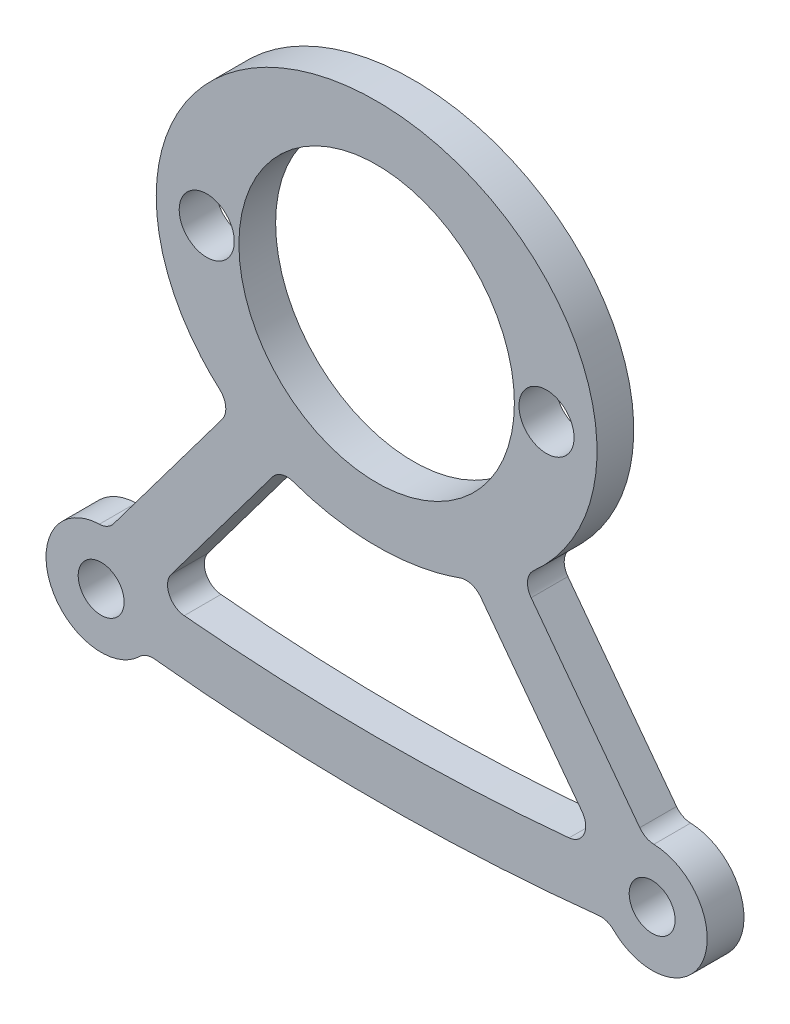
ISO-10303-21;
HEADER;
FILE_DESCRIPTION(('STEP AP214'),'2;1');
FILE_NAME('part.step','',(''),(''),'','','');
FILE_SCHEMA(('AUTOMOTIVE_DESIGN { 1 0 10303 214 1 1 1 1 }'));
ENDSEC;
DATA;
#1=APPLICATION_CONTEXT('core data for automotive mechanical design processes');
#2=APPLICATION_PROTOCOL_DEFINITION('international standard','automotive_design',2000,#1);
#3=PRODUCT_CONTEXT('',#1,'mechanical');
#4=PRODUCT('Part','Part','',(#3));
#5=PRODUCT_RELATED_PRODUCT_CATEGORY('part','',(#4));
#6=PRODUCT_DEFINITION_FORMATION('','',#4);
#7=PRODUCT_DEFINITION_CONTEXT('part definition',#1,'design');
#8=PRODUCT_DEFINITION('design','',#6,#7);
#9=PRODUCT_DEFINITION_SHAPE('','',#8);
#10=(LENGTH_UNIT() NAMED_UNIT(*) SI_UNIT(.MILLI.,.METRE.));
#11=(NAMED_UNIT(*) PLANE_ANGLE_UNIT() SI_UNIT($,.RADIAN.));
#12=(NAMED_UNIT(*) SI_UNIT($,.STERADIAN.) SOLID_ANGLE_UNIT());
#13=UNCERTAINTY_MEASURE_WITH_UNIT(LENGTH_MEASURE(1.E-05),#10,'distance_accuracy_value','');
#14=(GEOMETRIC_REPRESENTATION_CONTEXT(3) GLOBAL_UNCERTAINTY_ASSIGNED_CONTEXT((#13)) GLOBAL_UNIT_ASSIGNED_CONTEXT((#10,
#11,#12)) REPRESENTATION_CONTEXT('',''));
#15=CARTESIAN_POINT('',(0.,0.,0.));
#16=DIRECTION('',(0.,0.,1.));
#17=DIRECTION('',(1.,0.,0.));
#18=AXIS2_PLACEMENT_3D('',#15,#16,#17);
#19=CARTESIAN_POINT('',(-15.,-20.,0.));
#20=DIRECTION('',(0.,0.,1.));
#21=DIRECTION('',(1.,0.,0.));
#22=AXIS2_PLACEMENT_3D('',#19,#20,#21);
#23=PLANE('',#22);
#24=CARTESIAN_POINT('',(-15.,-20.,0.));
#25=DIRECTION('',(0.,0.,-1.));
#26=DIRECTION('',(-1.,0.,0.));
#27=AXIS2_PLACEMENT_3D('',#24,#25,#26);
#28=CIRCLE('',#27,1.24999999999999);
#29=CARTESIAN_POINT('',(-16.25,-20.,0.));
#30=VERTEX_POINT('',#29);
#31=EDGE_CURVE('E503',#30,#30,#28,.T.);
#32=ORIENTED_EDGE('',*,*,#31,.F.);
#33=EDGE_LOOP('',(#32));
#34=FACE_BOUND('',#33,.T.);
#35=CARTESIAN_POINT('',(0.,91.9999999999961,0.));
#36=DIRECTION('',(0.,0.,1.));
#37=DIRECTION('',(1.,0.,0.));
#38=AXIS2_PLACEMENT_3D('',#35,#36,#37);
#39=CIRCLE('',#38,111.499999999996);
#40=CARTESIAN_POINT('',(-10.477273878133,-19.0066517470129,0.));
#41=VERTEX_POINT('',#40);
#42=CARTESIAN_POINT('',(10.477273878133,-19.0066517470128,0.));
#43=VERTEX_POINT('',#42);
#44=EDGE_CURVE('E233',#41,#43,#39,.T.);
#45=ORIENTED_EDGE('',*,*,#44,.T.);
#46=CARTESIAN_POINT('',(10.3833072962663,-18.0110763950217,0.));
#47=DIRECTION('',(0.,0.,1.));
#48=DIRECTION('',(1.,0.,0.));
#49=AXIS2_PLACEMENT_3D('',#46,#47,#48);
#50=CIRCLE('',#49,0.999999999999994);
#51=CARTESIAN_POINT('',(11.1833072962663,-17.4110763950217,0.));
#52=VERTEX_POINT('',#51);
#53=EDGE_CURVE('E493',#43,#52,#50,.T.);
#54=ORIENTED_EDGE('',*,*,#53,.T.);
#55=DIRECTION('',(-0.6,0.8,0.));
#56=VECTOR('',#55,1.);
#57=CARTESIAN_POINT('',(5.21687893812231,-9.45583858416307,0.));
#58=LINE('',#57,#56);
#59=CARTESIAN_POINT('',(5.67209119562067,-10.0627882608276,0.));
#60=VERTEX_POINT('',#59);
#61=EDGE_CURVE('E199',#52,#60,#58,.T.);
#62=ORIENTED_EDGE('',*,*,#61,.T.);
#63=CARTESIAN_POINT('',(4.87209119562067,-10.6627882608276,0.));
#64=DIRECTION('',(0.,0.,1.));
#65=DIRECTION('',(1.,0.,0.));
#66=AXIS2_PLACEMENT_3D('',#63,#64,#65);
#67=CIRCLE('',#66,1.);
#68=CARTESIAN_POINT('',(4.53568418352964,-9.72107157189399,0.));
#69=VERTEX_POINT('',#68);
#70=EDGE_CURVE('E334',#60,#69,#67,.T.);
#71=ORIENTED_EDGE('',*,*,#70,.T.);
#72=CARTESIAN_POINT('',(0.,0.,0.));
#73=DIRECTION('',(0.,0.,1.));
#74=DIRECTION('',(1.,0.,0.));
#75=AXIS2_PLACEMENT_3D('',#72,#73,#74);
#76=ELLIPSE('',#75,12.,10.5);
#77=CARTESIAN_POINT('',(-4.53568418352963,-9.721071571894,0.));
#78=VERTEX_POINT('',#77);
#79=EDGE_CURVE('E279',#78,#69,#76,.T.);
#80=ORIENTED_EDGE('',*,*,#79,.F.);
#81=CARTESIAN_POINT('',(-4.87209119562066,-10.6627882608276,0.));
#82=DIRECTION('',(0.,0.,1.));
#83=DIRECTION('',(1.,0.,0.));
#84=AXIS2_PLACEMENT_3D('',#81,#82,#83);
#85=CIRCLE('',#84,1.);
#86=CARTESIAN_POINT('',(-5.67209119562067,-10.0627882608276,0.));
#87=VERTEX_POINT('',#86);
#88=EDGE_CURVE('E329',#78,#87,#85,.T.);
#89=ORIENTED_EDGE('',*,*,#88,.T.);
#90=DIRECTION('',(-0.6,-0.8,0.));
#91=VECTOR('',#90,1.);
#92=CARTESIAN_POINT('',(-5.21687893812231,-9.45583858416308,0.));
#93=LINE('',#92,#91);
#94=CARTESIAN_POINT('',(-11.1833072962663,-17.4110763950217,0.));
#95=VERTEX_POINT('',#94);
#96=EDGE_CURVE('E261',#87,#95,#93,.T.);
#97=ORIENTED_EDGE('',*,*,#96,.T.);
#98=CARTESIAN_POINT('',(-10.3833072962663,-18.0110763950217,0.));
#99=DIRECTION('',(0.,0.,1.));
#100=DIRECTION('',(1.,0.,0.));
#101=AXIS2_PLACEMENT_3D('',#98,#99,#100);
#102=CIRCLE('',#101,0.999999999999994);
#103=EDGE_CURVE('E489',#95,#41,#102,.T.);
#104=ORIENTED_EDGE('',*,*,#103,.T.);
#105=EDGE_LOOP('',(#45,#54,#62,#71,#80,#89,#97,#104));
#106=FACE_BOUND('',#105,.T.);
#107=CARTESIAN_POINT('',(-15.,-20.,0.));
#108=DIRECTION('',(0.,0.,1.));
#109=DIRECTION('',(1.,0.,0.));
#110=AXIS2_PLACEMENT_3D('',#107,#108,#109);
#111=CIRCLE('',#110,3.);
#112=CARTESIAN_POINT('',(-15.0948754503604,-17.0015006004805,0.));
#113=VERTEX_POINT('',#112);
#114=CARTESIAN_POINT('',(-12.8981322119877,-22.140596132323,0.));
#115=VERTEX_POINT('',#114);
#116=EDGE_CURVE('E247',#113,#115,#111,.T.);
#117=ORIENTED_EDGE('',*,*,#116,.F.);
#118=CARTESIAN_POINT('',(-15.1265006004805,-16.0020008006406,0.));
#119=DIRECTION('',(0.,0.,1.));
#120=DIRECTION('',(1.,0.,0.));
#121=AXIS2_PLACEMENT_3D('',#118,#119,#120);
#122=CIRCLE('',#121,1.);
#123=CARTESIAN_POINT('',(-14.3265006004805,-16.6020008006406,0.));
#124=VERTEX_POINT('',#123);
#125=EDGE_CURVE('E305',#113,#124,#122,.T.);
#126=ORIENTED_EDGE('',*,*,#125,.T.);
#127=DIRECTION('',(0.6,0.8,0.));
#128=VECTOR('',#127,1.);
#129=CARTESIAN_POINT('',(-7.83803934767862,-7.95071913023816,0.));
#130=LINE('',#129,#128);
#131=CARTESIAN_POINT('',(-8.41248000594852,-8.71664000793136,0.));
#132=VERTEX_POINT('',#131);
#133=EDGE_CURVE('E267',#124,#132,#130,.T.);
#134=ORIENTED_EDGE('',*,*,#133,.T.);
#135=CARTESIAN_POINT('',(-9.21248000594852,-8.11664000793136,0.));
#136=DIRECTION('',(0.,0.,1.));
#137=DIRECTION('',(1.,0.,0.));
#138=AXIS2_PLACEMENT_3D('',#135,#136,#137);
#139=CIRCLE('',#138,1.);
#140=CARTESIAN_POINT('',(-8.54841706416563,-7.36896333359234,0.));
#141=VERTEX_POINT('',#140);
#142=EDGE_CURVE('E339',#132,#141,#139,.T.);
#143=ORIENTED_EDGE('',*,*,#142,.T.);
#144=CARTESIAN_POINT('',(8.54841706416563,-7.36896333359234,0.));
#145=VERTEX_POINT('',#144);
#146=EDGE_CURVE('E278',#145,#141,#76,.T.);
#147=ORIENTED_EDGE('',*,*,#146,.F.);
#148=CARTESIAN_POINT('',(9.21248000594852,-8.11664000793136,0.));
#149=DIRECTION('',(0.,0.,1.));
#150=DIRECTION('',(1.,0.,0.));
#151=AXIS2_PLACEMENT_3D('',#148,#149,#150);
#152=CIRCLE('',#151,1.);
#153=CARTESIAN_POINT('',(8.41248000594852,-8.71664000793136,0.));
#154=VERTEX_POINT('',#153);
#155=EDGE_CURVE('E11',#145,#154,#152,.T.);
#156=ORIENTED_EDGE('',*,*,#155,.T.);
#157=DIRECTION('',(0.6,-0.8,0.));
#158=VECTOR('',#157,1.);
#159=CARTESIAN_POINT('',(7.83803934767862,-7.95071913023816,0.));
#160=LINE('',#159,#158);
#161=CARTESIAN_POINT('',(14.3265006004805,-16.6020008006406,0.));
#162=VERTEX_POINT('',#161);
#163=EDGE_CURVE('E214',#154,#162,#160,.T.);
#164=ORIENTED_EDGE('',*,*,#163,.T.);
#165=CARTESIAN_POINT('',(15.1265006004805,-16.0020008006406,0.));
#166=DIRECTION('',(0.,0.,1.));
#167=DIRECTION('',(1.,0.,0.));
#168=AXIS2_PLACEMENT_3D('',#165,#166,#167);
#169=CIRCLE('',#168,1.);
#170=CARTESIAN_POINT('',(15.0948754503604,-17.0015006004805,0.));
#171=VERTEX_POINT('',#170);
#172=EDGE_CURVE('E311',#162,#171,#169,.T.);
#173=ORIENTED_EDGE('',*,*,#172,.T.);
#174=CARTESIAN_POINT('',(15.,-20.,0.));
#175=DIRECTION('',(0.,0.,1.));
#176=DIRECTION('',(-1.,0.,0.));
#177=AXIS2_PLACEMENT_3D('',#174,#175,#176);
#178=CIRCLE('',#177,3.);
#179=CARTESIAN_POINT('',(12.8981322119876,-22.140596132323,0.));
#180=VERTEX_POINT('',#179);
#181=EDGE_CURVE('E224',#180,#171,#178,.T.);
#182=ORIENTED_EDGE('',*,*,#181,.F.);
#183=CARTESIAN_POINT('',(12.1975096159834,-22.8541281764308,0.));
#184=DIRECTION('',(0.,0.,1.));
#185=DIRECTION('',(1.,0.,0.));
#186=AXIS2_PLACEMENT_3D('',#183,#184,#185);
#187=CIRCLE('',#186,1.);
#188=CARTESIAN_POINT('',(12.091903472122,-21.8597201402712,0.));
#189=VERTEX_POINT('',#188);
#190=EDGE_CURVE('E317',#180,#189,#187,.T.);
#191=ORIENTED_EDGE('',*,*,#190,.T.);
#192=CARTESIAN_POINT('',(0.,91.9999999999961,0.));
#193=DIRECTION('',(0.,0.,1.));
#194=DIRECTION('',(1.,0.,0.));
#195=AXIS2_PLACEMENT_3D('',#192,#193,#194);
#196=CIRCLE('',#195,114.499999999996);
#197=CARTESIAN_POINT('',(-12.0919034721223,-21.8597201402712,0.));
#198=VERTEX_POINT('',#197);
#199=EDGE_CURVE('E237',#189,#198,#196,.F.);
#200=ORIENTED_EDGE('',*,*,#199,.T.);
#201=CARTESIAN_POINT('',(-12.1975096159836,-22.8541281764307,0.));
#202=DIRECTION('',(0.,0.,1.));
#203=DIRECTION('',(1.,0.,0.));
#204=AXIS2_PLACEMENT_3D('',#201,#202,#203);
#205=CIRCLE('',#204,1.);
#206=EDGE_CURVE('E323',#198,#115,#205,.T.);
#207=ORIENTED_EDGE('',*,*,#206,.T.);
#208=EDGE_LOOP('',(#117,#126,#134,#143,#147,#156,#164,#173,#182,#191,#200,#207));
#209=FACE_BOUND('',#208,.T.);
#210=CARTESIAN_POINT('',(0.,0.,0.));
#211=DIRECTION('',(0.,0.,1.));
#212=DIRECTION('',(1.,0.,0.));
#213=AXIS2_PLACEMENT_3D('',#210,#211,#212);
#214=CIRCLE('',#213,7.5);
#215=CARTESIAN_POINT('',(7.5,0.,0.));
#216=VERTEX_POINT('',#215);
#217=EDGE_CURVE('E283',#216,#216,#214,.T.);
#218=ORIENTED_EDGE('',*,*,#217,.T.);
#219=EDGE_LOOP('',(#218));
#220=FACE_BOUND('',#219,.T.);
#221=CARTESIAN_POINT('',(9.25,0.,0.));
#222=DIRECTION('',(0.,0.,1.));
#223=DIRECTION('',(1.,0.,0.));
#224=AXIS2_PLACEMENT_3D('',#221,#222,#223);
#225=CIRCLE('',#224,1.5);
#226=CARTESIAN_POINT('',(10.75,0.,0.));
#227=VERTEX_POINT('',#226);
#228=EDGE_CURVE('E467',#227,#227,#225,.T.);
#229=ORIENTED_EDGE('',*,*,#228,.T.);
#230=EDGE_LOOP('',(#229));
#231=FACE_BOUND('',#230,.T.);
#232=CARTESIAN_POINT('',(-9.25,0.,0.));
#233=DIRECTION('',(0.,0.,1.));
#234=DIRECTION('',(-1.,0.,0.));
#235=AXIS2_PLACEMENT_3D('',#232,#233,#234);
#236=CIRCLE('',#235,1.5);
#237=CARTESIAN_POINT('',(-10.75,0.,0.));
#238=VERTEX_POINT('',#237);
#239=EDGE_CURVE('E266',#238,#238,#236,.T.);
#240=ORIENTED_EDGE('',*,*,#239,.T.);
#241=EDGE_LOOP('',(#240));
#242=FACE_BOUND('',#241,.T.);
#243=CARTESIAN_POINT('',(15.,-20.,0.));
#244=DIRECTION('',(0.,0.,-1.));
#245=DIRECTION('',(-1.,0.,0.));
#246=AXIS2_PLACEMENT_3D('',#243,#244,#245);
#247=CIRCLE('',#246,1.24999999999999);
#248=CARTESIAN_POINT('',(13.75,-20.,0.));
#249=VERTEX_POINT('',#248);
#250=EDGE_CURVE('E511',#249,#249,#247,.T.);
#251=ORIENTED_EDGE('',*,*,#250,.F.);
#252=EDGE_LOOP('',(#251));
#253=FACE_BOUND('',#252,.T.);
#254=ADVANCED_FACE('F44',(#34,#106,#209,#220,#231,#242,#253),#23,.F.);
#255=CARTESIAN_POINT('',(-15.,-20.,2.));
#256=DIRECTION('',(0.,0.,1.));
#257=DIRECTION('',(1.,0.,0.));
#258=AXIS2_PLACEMENT_3D('',#255,#256,#257);
#259=PLANE('',#258);
#260=CARTESIAN_POINT('',(15.,-20.,2.));
#261=DIRECTION('',(0.,0.,-1.));
#262=DIRECTION('',(-1.,0.,0.));
#263=AXIS2_PLACEMENT_3D('',#260,#261,#262);
#264=CIRCLE('',#263,1.25);
#265=CARTESIAN_POINT('',(13.75,-20.,2.));
#266=VERTEX_POINT('',#265);
#267=EDGE_CURVE('E507',#266,#266,#264,.T.);
#268=ORIENTED_EDGE('',*,*,#267,.T.);
#269=EDGE_LOOP('',(#268));
#270=FACE_BOUND('',#269,.T.);
#271=CARTESIAN_POINT('',(-9.25,0.,2.));
#272=DIRECTION('',(0.,0.,1.));
#273=DIRECTION('',(-1.,0.,0.));
#274=AXIS2_PLACEMENT_3D('',#271,#272,#273);
#275=CIRCLE('',#274,1.5);
#276=CARTESIAN_POINT('',(-10.75,0.,2.));
#277=VERTEX_POINT('',#276);
#278=EDGE_CURVE('E471',#277,#277,#275,.T.);
#279=ORIENTED_EDGE('',*,*,#278,.F.);
#280=EDGE_LOOP('',(#279));
#281=FACE_BOUND('',#280,.T.);
#282=CARTESIAN_POINT('',(0.,0.,2.));
#283=DIRECTION('',(0.,0.,1.));
#284=DIRECTION('',(1.,0.,0.));
#285=AXIS2_PLACEMENT_3D('',#282,#283,#284);
#286=CIRCLE('',#285,7.5);
#287=CARTESIAN_POINT('',(7.5,0.,2.));
#288=VERTEX_POINT('',#287);
#289=EDGE_CURVE('E455',#288,#288,#286,.T.);
#290=ORIENTED_EDGE('',*,*,#289,.F.);
#291=EDGE_LOOP('',(#290));
#292=FACE_BOUND('',#291,.T.);
#293=CARTESIAN_POINT('',(9.25,0.,2.));
#294=DIRECTION('',(0.,0.,1.));
#295=DIRECTION('',(1.,0.,0.));
#296=AXIS2_PLACEMENT_3D('',#293,#294,#295);
#297=CIRCLE('',#296,1.5);
#298=CARTESIAN_POINT('',(10.75,0.,2.));
#299=VERTEX_POINT('',#298);
#300=EDGE_CURVE('E465',#299,#299,#297,.T.);
#301=ORIENTED_EDGE('',*,*,#300,.F.);
#302=EDGE_LOOP('',(#301));
#303=FACE_BOUND('',#302,.T.);
#304=CARTESIAN_POINT('',(0.,0.,2.));
#305=DIRECTION('',(0.,0.,1.));
#306=DIRECTION('',(1.,0.,0.));
#307=AXIS2_PLACEMENT_3D('',#304,#305,#306);
#308=ELLIPSE('',#307,12.,10.5);
#309=CARTESIAN_POINT('',(8.54841706416563,-7.36896333359234,2.));
#310=VERTEX_POINT('',#309);
#311=CARTESIAN_POINT('',(-8.54841706416563,-7.36896333359234,2.));
#312=VERTEX_POINT('',#311);
#313=EDGE_CURVE('E208',#310,#312,#308,.T.);
#314=ORIENTED_EDGE('',*,*,#313,.T.);
#315=CARTESIAN_POINT('',(-9.21248000594852,-8.11664000793136,2.));
#316=DIRECTION('',(0.,0.,1.));
#317=DIRECTION('',(1.,0.,0.));
#318=AXIS2_PLACEMENT_3D('',#315,#316,#317);
#319=CIRCLE('',#318,1.);
#320=CARTESIAN_POINT('',(-8.41248000594852,-8.71664000793136,2.));
#321=VERTEX_POINT('',#320);
#322=EDGE_CURVE('E70',#312,#321,#319,.F.);
#323=ORIENTED_EDGE('',*,*,#322,.T.);
#324=DIRECTION('',(-0.6,-0.8,0.));
#325=VECTOR('',#324,1.);
#326=CARTESIAN_POINT('',(-7.83803934767862,-7.95071913023816,2.));
#327=LINE('',#326,#325);
#328=CARTESIAN_POINT('',(-14.3265006004805,-16.6020008006406,2.));
#329=VERTEX_POINT('',#328);
#330=EDGE_CURVE('E571',#321,#329,#327,.T.);
#331=ORIENTED_EDGE('',*,*,#330,.T.);
#332=CARTESIAN_POINT('',(-15.1265006004805,-16.0020008006406,2.));
#333=DIRECTION('',(0.,0.,1.));
#334=DIRECTION('',(1.,0.,0.));
#335=AXIS2_PLACEMENT_3D('',#332,#333,#334);
#336=CIRCLE('',#335,1.);
#337=CARTESIAN_POINT('',(-15.0948754503604,-17.0015006004805,2.));
#338=VERTEX_POINT('',#337);
#339=EDGE_CURVE('E302',#329,#338,#336,.F.);
#340=ORIENTED_EDGE('',*,*,#339,.T.);
#341=CARTESIAN_POINT('',(-15.,-20.,2.));
#342=DIRECTION('',(0.,0.,1.));
#343=DIRECTION('',(1.,0.,0.));
#344=AXIS2_PLACEMENT_3D('',#341,#342,#343);
#345=CIRCLE('',#344,3.);
#346=CARTESIAN_POINT('',(-12.8981322119877,-22.140596132323,2.));
#347=VERTEX_POINT('',#346);
#348=EDGE_CURVE('E248',#338,#347,#345,.T.);
#349=ORIENTED_EDGE('',*,*,#348,.T.);
#350=CARTESIAN_POINT('',(-12.1975096159836,-22.8541281764307,2.));
#351=DIRECTION('',(0.,0.,1.));
#352=DIRECTION('',(1.,0.,0.));
#353=AXIS2_PLACEMENT_3D('',#350,#351,#352);
#354=CIRCLE('',#353,1.);
#355=CARTESIAN_POINT('',(-12.0919034721223,-21.8597201402712,2.));
#356=VERTEX_POINT('',#355);
#357=EDGE_CURVE('E320',#347,#356,#354,.F.);
#358=ORIENTED_EDGE('',*,*,#357,.T.);
#359=CARTESIAN_POINT('',(0.,91.9999999999961,2.));
#360=DIRECTION('',(0.,0.,1.));
#361=DIRECTION('',(1.,0.,0.));
#362=AXIS2_PLACEMENT_3D('',#359,#360,#361);
#363=CIRCLE('',#362,114.499999999996);
#364=CARTESIAN_POINT('',(12.091903472122,-21.8597201402712,2.));
#365=VERTEX_POINT('',#364);
#366=EDGE_CURVE('E229',#356,#365,#363,.T.);
#367=ORIENTED_EDGE('',*,*,#366,.T.);
#368=CARTESIAN_POINT('',(12.1975096159834,-22.8541281764308,2.));
#369=DIRECTION('',(0.,0.,1.));
#370=DIRECTION('',(1.,0.,0.));
#371=AXIS2_PLACEMENT_3D('',#368,#369,#370);
#372=CIRCLE('',#371,1.);
#373=CARTESIAN_POINT('',(12.8981322119876,-22.140596132323,2.));
#374=VERTEX_POINT('',#373);
#375=EDGE_CURVE('E314',#365,#374,#372,.F.);
#376=ORIENTED_EDGE('',*,*,#375,.T.);
#377=CARTESIAN_POINT('',(15.,-20.,2.));
#378=DIRECTION('',(0.,0.,1.));
#379=DIRECTION('',(-1.,0.,0.));
#380=AXIS2_PLACEMENT_3D('',#377,#378,#379);
#381=CIRCLE('',#380,3.);
#382=CARTESIAN_POINT('',(15.0948754503604,-17.0015006004805,2.));
#383=VERTEX_POINT('',#382);
#384=EDGE_CURVE('E225',#374,#383,#381,.T.);
#385=ORIENTED_EDGE('',*,*,#384,.T.);
#386=CARTESIAN_POINT('',(15.1265006004805,-16.0020008006406,2.));
#387=DIRECTION('',(0.,0.,1.));
#388=DIRECTION('',(1.,0.,0.));
#389=AXIS2_PLACEMENT_3D('',#386,#387,#388);
#390=CIRCLE('',#389,1.);
#391=CARTESIAN_POINT('',(14.3265006004805,-16.6020008006406,2.));
#392=VERTEX_POINT('',#391);
#393=EDGE_CURVE('E308',#383,#392,#390,.F.);
#394=ORIENTED_EDGE('',*,*,#393,.T.);
#395=DIRECTION('',(-0.6,0.8,0.));
#396=VECTOR('',#395,1.);
#397=CARTESIAN_POINT('',(7.83803934767862,-7.95071913023816,2.));
#398=LINE('',#397,#396);
#399=CARTESIAN_POINT('',(8.41248000594852,-8.71664000793136,2.));
#400=VERTEX_POINT('',#399);
#401=EDGE_CURVE('E207',#392,#400,#398,.T.);
#402=ORIENTED_EDGE('',*,*,#401,.T.);
#403=CARTESIAN_POINT('',(9.21248000594852,-8.11664000793136,2.));
#404=DIRECTION('',(0.,0.,1.));
#405=DIRECTION('',(1.,0.,0.));
#406=AXIS2_PLACEMENT_3D('',#403,#404,#405);
#407=CIRCLE('',#406,1.);
#408=EDGE_CURVE('E55',#400,#310,#407,.F.);
#409=ORIENTED_EDGE('',*,*,#408,.T.);
#410=EDGE_LOOP('',(#314,#323,#331,#340,#349,#358,#367,#376,#385,#394,#402,#409));
#411=FACE_BOUND('',#410,.T.);
#412=CARTESIAN_POINT('',(10.3833072962663,-18.0110763950217,2.));
#413=DIRECTION('',(0.,0.,-1.));
#414=DIRECTION('',(-1.,0.,0.));
#415=AXIS2_PLACEMENT_3D('',#412,#413,#414);
#416=CIRCLE('',#415,0.999999999999994);
#417=CARTESIAN_POINT('',(11.1833072962663,-17.4110763950217,2.));
#418=VERTEX_POINT('',#417);
#419=CARTESIAN_POINT('',(10.477273878133,-19.0066517470129,2.));
#420=VERTEX_POINT('',#419);
#421=EDGE_CURVE('E182',#418,#420,#416,.T.);
#422=ORIENTED_EDGE('',*,*,#421,.T.);
#423=CARTESIAN_POINT('',(0.,91.9999999999961,2.));
#424=DIRECTION('',(0.,0.,-1.));
#425=DIRECTION('',(1.,0.,0.));
#426=AXIS2_PLACEMENT_3D('',#423,#424,#425);
#427=CIRCLE('',#426,111.499999999996);
#428=CARTESIAN_POINT('',(-10.477273878133,-19.0066517470129,2.));
#429=VERTEX_POINT('',#428);
#430=EDGE_CURVE('E238',#420,#429,#427,.T.);
#431=ORIENTED_EDGE('',*,*,#430,.T.);
#432=CARTESIAN_POINT('',(-10.3833072962663,-18.0110763950217,2.));
#433=DIRECTION('',(0.,0.,-1.));
#434=DIRECTION('',(1.,0.,0.));
#435=AXIS2_PLACEMENT_3D('',#432,#433,#434);
#436=CIRCLE('',#435,0.999999999999994);
#437=CARTESIAN_POINT('',(-11.1833072962663,-17.4110763950217,2.));
#438=VERTEX_POINT('',#437);
#439=EDGE_CURVE('E485',#429,#438,#436,.T.);
#440=ORIENTED_EDGE('',*,*,#439,.T.);
#441=DIRECTION('',(0.6,0.8,0.));
#442=VECTOR('',#441,1.);
#443=CARTESIAN_POINT('',(-5.21687893812231,-9.45583858416308,2.));
#444=LINE('',#443,#442);
#445=CARTESIAN_POINT('',(-5.67209119562067,-10.0627882608276,2.));
#446=VERTEX_POINT('',#445);
#447=EDGE_CURVE('E48',#438,#446,#444,.T.);
#448=ORIENTED_EDGE('',*,*,#447,.T.);
#449=CARTESIAN_POINT('',(-4.87209119562066,-10.6627882608276,2.));
#450=DIRECTION('',(0.,0.,1.));
#451=DIRECTION('',(1.,0.,0.));
#452=AXIS2_PLACEMENT_3D('',#449,#450,#451);
#453=CIRCLE('',#452,1.);
#454=CARTESIAN_POINT('',(-4.53568418352963,-9.721071571894,2.));
#455=VERTEX_POINT('',#454);
#456=EDGE_CURVE('E326',#446,#455,#453,.F.);
#457=ORIENTED_EDGE('',*,*,#456,.T.);
#458=CARTESIAN_POINT('',(4.53568418352964,-9.72107157189399,2.));
#459=VERTEX_POINT('',#458);
#460=EDGE_CURVE('E217',#455,#459,#308,.T.);
#461=ORIENTED_EDGE('',*,*,#460,.T.);
#462=CARTESIAN_POINT('',(4.87209119562067,-10.6627882608276,2.));
#463=DIRECTION('',(0.,0.,1.));
#464=DIRECTION('',(1.,0.,0.));
#465=AXIS2_PLACEMENT_3D('',#462,#463,#464);
#466=CIRCLE('',#465,1.);
#467=CARTESIAN_POINT('',(5.67209119562067,-10.0627882608276,2.));
#468=VERTEX_POINT('',#467);
#469=EDGE_CURVE('E205',#459,#468,#466,.F.);
#470=ORIENTED_EDGE('',*,*,#469,.T.);
#471=DIRECTION('',(0.6,-0.8,0.));
#472=VECTOR('',#471,1.);
#473=CARTESIAN_POINT('',(5.21687893812231,-9.45583858416307,2.));
#474=LINE('',#473,#472);
#475=EDGE_CURVE('E197',#468,#418,#474,.T.);
#476=ORIENTED_EDGE('',*,*,#475,.T.);
#477=EDGE_LOOP('',(#422,#431,#440,#448,#457,#461,#470,#476));
#478=FACE_BOUND('',#477,.T.);
#479=CARTESIAN_POINT('',(-15.,-20.,2.));
#480=DIRECTION('',(0.,0.,-1.));
#481=DIRECTION('',(-1.,0.,0.));
#482=AXIS2_PLACEMENT_3D('',#479,#480,#481);
#483=CIRCLE('',#482,1.25);
#484=CARTESIAN_POINT('',(-16.25,-20.,2.));
#485=VERTEX_POINT('',#484);
#486=EDGE_CURVE('E190',#485,#485,#483,.T.);
#487=ORIENTED_EDGE('',*,*,#486,.T.);
#488=EDGE_LOOP('',(#487));
#489=FACE_BOUND('',#488,.T.);
#490=ADVANCED_FACE('F202',(#270,#281,#292,#303,#411,#478,#489),#259,.T.);
#491=CARTESIAN_POINT('',(0.,91.9999999999961,-25.4727148741524));
#492=DIRECTION('',(0.,0.,1.));
#493=DIRECTION('',(1.,0.,0.));
#494=AXIS2_PLACEMENT_3D('',#491,#492,#493);
#495=CYLINDRICAL_SURFACE('',#494,111.499999999996);
#496=DIRECTION('',(0.,0.,1.));
#497=VECTOR('',#496,1.);
#498=CARTESIAN_POINT('',(10.477273878133,-19.0066517470129,-2.37847319765035));
#499=LINE('',#498,#497);
#500=EDGE_CURVE('E185',#43,#420,#499,.T.);
#501=ORIENTED_EDGE('',*,*,#500,.F.);
#502=ORIENTED_EDGE('',*,*,#44,.F.);
#503=DIRECTION('',(0.,0.,1.));
#504=VECTOR('',#503,1.);
#505=CARTESIAN_POINT('',(-10.477273878133,-19.0066517470129,-2.37847319765035));
#506=LINE('',#505,#504);
#507=EDGE_CURVE('E484',#41,#429,#506,.T.);
#508=ORIENTED_EDGE('',*,*,#507,.T.);
#509=ORIENTED_EDGE('',*,*,#430,.F.);
#510=EDGE_LOOP('',(#501,#502,#508,#509));
#511=FACE_BOUND('',#510,.T.);
#512=ADVANCED_FACE('F525',(#511),#495,.F.);
#513=CARTESIAN_POINT('',(-5.21687893812231,-9.45583858416308,-25.4727148741524));
#514=DIRECTION('',(0.8,-0.6,0.));
#515=DIRECTION('',(0.6,0.8,0.));
#516=AXIS2_PLACEMENT_3D('',#513,#514,#515);
#517=PLANE('',#516);
#518=ORIENTED_EDGE('',*,*,#447,.F.);
#519=DIRECTION('',(0.,0.,1.));
#520=VECTOR('',#519,1.);
#521=CARTESIAN_POINT('',(-11.1833072962663,-17.4110763950217,-2.37847319765035));
#522=LINE('',#521,#520);
#523=EDGE_CURVE('E481',#95,#438,#522,.T.);
#524=ORIENTED_EDGE('',*,*,#523,.F.);
#525=ORIENTED_EDGE('',*,*,#96,.F.);
#526=DIRECTION('',(0.,0.,-1.));
#527=VECTOR('',#526,1.);
#528=CARTESIAN_POINT('',(-5.67209119562067,-10.0627882608276,-25.4727148741524));
#529=LINE('',#528,#527);
#530=EDGE_CURVE('E270',#87,#446,#529,.F.);
#531=ORIENTED_EDGE('',*,*,#530,.T.);
#532=EDGE_LOOP('',(#518,#524,#525,#531));
#533=FACE_BOUND('',#532,.T.);
#534=ADVANCED_FACE('F534',(#533),#517,.T.);
#535=CARTESIAN_POINT('',(-15.,-20.,2.));
#536=DIRECTION('',(0.,0.,-1.));
#537=DIRECTION('',(-1.,0.,0.));
#538=AXIS2_PLACEMENT_3D('',#535,#536,#537);
#539=CYLINDRICAL_SURFACE('',#538,3.);
#540=ORIENTED_EDGE('',*,*,#348,.F.);
#541=DIRECTION('',(0.,0.,-1.));
#542=VECTOR('',#541,1.);
#543=CARTESIAN_POINT('',(-15.0948754503604,-17.0015006004805,2.));
#544=LINE('',#543,#542);
#545=EDGE_CURVE('E392',#338,#113,#544,.T.);
#546=ORIENTED_EDGE('',*,*,#545,.T.);
#547=ORIENTED_EDGE('',*,*,#116,.T.);
#548=DIRECTION('',(0.,0.,-1.));
#549=VECTOR('',#548,1.);
#550=CARTESIAN_POINT('',(-12.8981322119877,-22.140596132323,2.));
#551=LINE('',#550,#549);
#552=EDGE_CURVE('E387',#115,#347,#551,.F.);
#553=ORIENTED_EDGE('',*,*,#552,.T.);
#554=EDGE_LOOP('',(#540,#546,#547,#553));
#555=FACE_BOUND('',#554,.T.);
#556=ADVANCED_FACE('F531',(#555),#539,.T.);
#557=DIRECTION('',(0.,0.,-1.));
#558=VECTOR('',#557,1.);
#559=SURFACE_OF_LINEAR_EXTRUSION('',#308,#558);
#560=ORIENTED_EDGE('',*,*,#146,.T.);
#561=DIRECTION('',(0.,0.,-1.));
#562=VECTOR('',#561,1.);
#563=CARTESIAN_POINT('',(-8.54841706416563,-7.36896333359234,0.));
#564=LINE('',#563,#562);
#565=EDGE_CURVE('E298',#141,#312,#564,.F.);
#566=ORIENTED_EDGE('',*,*,#565,.T.);
#567=ORIENTED_EDGE('',*,*,#313,.F.);
#568=DIRECTION('',(0.,0.,-1.));
#569=VECTOR('',#568,1.);
#570=CARTESIAN_POINT('',(8.54841706416563,-7.36896333359234,2.));
#571=LINE('',#570,#569);
#572=EDGE_CURVE('E295',#310,#145,#571,.T.);
#573=ORIENTED_EDGE('',*,*,#572,.T.);
#574=EDGE_LOOP('',(#560,#566,#567,#573));
#575=FACE_BOUND('',#574,.T.);
#576=ADVANCED_FACE('F353',(#575),#559,.F.);
#577=CARTESIAN_POINT('',(15.,-20.,2.));
#578=DIRECTION('',(0.,0.,-1.));
#579=DIRECTION('',(-1.,0.,0.));
#580=AXIS2_PLACEMENT_3D('',#577,#578,#579);
#581=CYLINDRICAL_SURFACE('',#580,3.);
#582=ORIENTED_EDGE('',*,*,#181,.T.);
#583=DIRECTION('',(0.,0.,-1.));
#584=VECTOR('',#583,1.);
#585=CARTESIAN_POINT('',(15.0948754503604,-17.0015006004805,2.));
#586=LINE('',#585,#584);
#587=EDGE_CURVE('E400',#171,#383,#586,.F.);
#588=ORIENTED_EDGE('',*,*,#587,.T.);
#589=ORIENTED_EDGE('',*,*,#384,.F.);
#590=DIRECTION('',(0.,0.,-1.));
#591=VECTOR('',#590,1.);
#592=CARTESIAN_POINT('',(12.8981322119876,-22.140596132323,2.));
#593=LINE('',#592,#591);
#594=EDGE_CURVE('E396',#374,#180,#593,.T.);
#595=ORIENTED_EDGE('',*,*,#594,.T.);
#596=EDGE_LOOP('',(#582,#588,#589,#595));
#597=FACE_BOUND('',#596,.T.);
#598=ADVANCED_FACE('F601',(#597),#581,.T.);
#599=CARTESIAN_POINT('',(0.,91.9999999999961,-25.4727148741524));
#600=DIRECTION('',(0.,0.,1.));
#601=DIRECTION('',(1.,0.,0.));
#602=AXIS2_PLACEMENT_3D('',#599,#600,#601);
#603=CYLINDRICAL_SURFACE('',#602,114.499999999996);
#604=ORIENTED_EDGE('',*,*,#199,.F.);
#605=DIRECTION('',(0.,0.,1.));
#606=VECTOR('',#605,1.);
#607=CARTESIAN_POINT('',(12.091903472122,-21.8597201402712,-25.4727148741524));
#608=LINE('',#607,#606);
#609=EDGE_CURVE('E268',#189,#365,#608,.T.);
#610=ORIENTED_EDGE('',*,*,#609,.T.);
#611=ORIENTED_EDGE('',*,*,#366,.F.);
#612=DIRECTION('',(0.,0.,1.));
#613=VECTOR('',#612,1.);
#614=CARTESIAN_POINT('',(-12.0919034721223,-21.8597201402712,-25.4727148741524));
#615=LINE('',#614,#613);
#616=EDGE_CURVE('E411',#356,#198,#615,.F.);
#617=ORIENTED_EDGE('',*,*,#616,.T.);
#618=EDGE_LOOP('',(#604,#610,#611,#617));
#619=FACE_BOUND('',#618,.T.);
#620=ADVANCED_FACE('F603',(#619),#603,.T.);
#621=CARTESIAN_POINT('',(7.83803934767862,-7.95071913023816,-25.4727148741524));
#622=DIRECTION('',(0.8,0.6,0.));
#623=DIRECTION('',(-0.6,0.8,0.));
#624=AXIS2_PLACEMENT_3D('',#621,#622,#623);
#625=PLANE('',#624);
#626=ORIENTED_EDGE('',*,*,#401,.F.);
#627=DIRECTION('',(0.,0.,-1.));
#628=VECTOR('',#627,1.);
#629=CARTESIAN_POINT('',(14.3265006004805,-16.6020008006406,-25.4727148741524));
#630=LINE('',#629,#628);
#631=EDGE_CURVE('E366',#392,#162,#630,.T.);
#632=ORIENTED_EDGE('',*,*,#631,.T.);
#633=ORIENTED_EDGE('',*,*,#163,.F.);
#634=DIRECTION('',(0.,0.,-1.));
#635=VECTOR('',#634,1.);
#636=CARTESIAN_POINT('',(8.41248000594852,-8.71664000793136,-25.4727148741524));
#637=LINE('',#636,#635);
#638=EDGE_CURVE('E356',#154,#400,#637,.F.);
#639=ORIENTED_EDGE('',*,*,#638,.T.);
#640=EDGE_LOOP('',(#626,#632,#633,#639));
#641=FACE_BOUND('',#640,.T.);
#642=ADVANCED_FACE('F364',(#641),#625,.T.);
#643=CARTESIAN_POINT('',(5.21687893812231,-9.45583858416307,-25.4727148741524));
#644=DIRECTION('',(-0.8,-0.6,0.));
#645=DIRECTION('',(0.6,-0.8,0.));
#646=AXIS2_PLACEMENT_3D('',#643,#644,#645);
#647=PLANE('',#646);
#648=DIRECTION('',(0.,0.,1.));
#649=VECTOR('',#648,1.);
#650=CARTESIAN_POINT('',(11.1833072962663,-17.4110763950217,-2.37847319765035));
#651=LINE('',#650,#649);
#652=EDGE_CURVE('E62',#52,#418,#651,.T.);
#653=ORIENTED_EDGE('',*,*,#652,.T.);
#654=ORIENTED_EDGE('',*,*,#475,.F.);
#655=DIRECTION('',(0.,0.,-1.));
#656=VECTOR('',#655,1.);
#657=CARTESIAN_POINT('',(5.67209119562067,-10.0627882608276,-25.4727148741524));
#658=LINE('',#657,#656);
#659=EDGE_CURVE('E299',#468,#60,#658,.T.);
#660=ORIENTED_EDGE('',*,*,#659,.T.);
#661=ORIENTED_EDGE('',*,*,#61,.F.);
#662=EDGE_LOOP('',(#653,#654,#660,#661));
#663=FACE_BOUND('',#662,.T.);
#664=ADVANCED_FACE('F195',(#663),#647,.T.);
#665=ORIENTED_EDGE('',*,*,#460,.F.);
#666=DIRECTION('',(0.,0.,-1.));
#667=VECTOR('',#666,1.);
#668=CARTESIAN_POINT('',(-4.53568418352963,-9.721071571894,2.));
#669=LINE('',#668,#667);
#670=EDGE_CURVE('E422',#455,#78,#669,.T.);
#671=ORIENTED_EDGE('',*,*,#670,.T.);
#672=ORIENTED_EDGE('',*,*,#79,.T.);
#673=DIRECTION('',(0.,0.,-1.));
#674=VECTOR('',#673,1.);
#675=CARTESIAN_POINT('',(4.53568418352964,-9.72107157189399,0.));
#676=LINE('',#675,#674);
#677=EDGE_CURVE('E274',#69,#459,#676,.F.);
#678=ORIENTED_EDGE('',*,*,#677,.T.);
#679=EDGE_LOOP('',(#665,#671,#672,#678));
#680=FACE_BOUND('',#679,.T.);
#681=ADVANCED_FACE('F289',(#680),#559,.F.);
#682=CARTESIAN_POINT('',(0.,0.,2.));
#683=DIRECTION('',(0.,0.,-1.));
#684=DIRECTION('',(-1.,0.,0.));
#685=AXIS2_PLACEMENT_3D('',#682,#683,#684);
#686=CYLINDRICAL_SURFACE('',#685,7.5);
#687=ORIENTED_EDGE('',*,*,#289,.T.);
#688=EDGE_LOOP('',(#687));
#689=FACE_BOUND('',#688,.T.);
#690=ORIENTED_EDGE('',*,*,#217,.F.);
#691=EDGE_LOOP('',(#690));
#692=FACE_BOUND('',#691,.T.);
#693=ADVANCED_FACE('F637',(#689,#692),#686,.F.);
#694=CARTESIAN_POINT('',(9.25,0.,2.));
#695=DIRECTION('',(0.,0.,-1.));
#696=DIRECTION('',(-1.,0.,0.));
#697=AXIS2_PLACEMENT_3D('',#694,#695,#696);
#698=CYLINDRICAL_SURFACE('',#697,1.5);
#699=ORIENTED_EDGE('',*,*,#300,.T.);
#700=EDGE_LOOP('',(#699));
#701=FACE_BOUND('',#700,.T.);
#702=ORIENTED_EDGE('',*,*,#228,.F.);
#703=EDGE_LOOP('',(#702));
#704=FACE_BOUND('',#703,.T.);
#705=ADVANCED_FACE('F630',(#701,#704),#698,.F.);
#706=CARTESIAN_POINT('',(-9.25,0.,2.));
#707=DIRECTION('',(0.,0.,-1.));
#708=DIRECTION('',(-1.,0.,0.));
#709=AXIS2_PLACEMENT_3D('',#706,#707,#708);
#710=CYLINDRICAL_SURFACE('',#709,1.5);
#711=ORIENTED_EDGE('',*,*,#278,.T.);
#712=EDGE_LOOP('',(#711));
#713=FACE_BOUND('',#712,.T.);
#714=ORIENTED_EDGE('',*,*,#239,.F.);
#715=EDGE_LOOP('',(#714));
#716=FACE_BOUND('',#715,.T.);
#717=ADVANCED_FACE('F625',(#713,#716),#710,.F.);
#718=CARTESIAN_POINT('',(-7.83803934767862,-7.95071913023816,-25.4727148741524));
#719=DIRECTION('',(-0.8,0.6,0.));
#720=DIRECTION('',(-0.6,-0.8,0.));
#721=AXIS2_PLACEMENT_3D('',#718,#719,#720);
#722=PLANE('',#721);
#723=ORIENTED_EDGE('',*,*,#133,.F.);
#724=DIRECTION('',(0.,0.,-1.));
#725=VECTOR('',#724,1.);
#726=CARTESIAN_POINT('',(-14.3265006004805,-16.6020008006406,-25.4727148741524));
#727=LINE('',#726,#725);
#728=EDGE_CURVE('E382',#124,#329,#727,.F.);
#729=ORIENTED_EDGE('',*,*,#728,.T.);
#730=ORIENTED_EDGE('',*,*,#330,.F.);
#731=DIRECTION('',(0.,0.,-1.));
#732=VECTOR('',#731,1.);
#733=CARTESIAN_POINT('',(-8.41248000594852,-8.71664000793136,-25.4727148741524));
#734=LINE('',#733,#732);
#735=EDGE_CURVE('E252',#321,#132,#734,.T.);
#736=ORIENTED_EDGE('',*,*,#735,.T.);
#737=EDGE_LOOP('',(#723,#729,#730,#736));
#738=FACE_BOUND('',#737,.T.);
#739=ADVANCED_FACE('F540',(#738),#722,.T.);
#740=CARTESIAN_POINT('',(-15.1265006004805,-16.0020008006406,2.));
#741=DIRECTION('',(0.,0.,-1.));
#742=DIRECTION('',(-1.,0.,0.));
#743=AXIS2_PLACEMENT_3D('',#740,#741,#742);
#744=CYLINDRICAL_SURFACE('',#743,1.);
#745=ORIENTED_EDGE('',*,*,#125,.F.);
#746=ORIENTED_EDGE('',*,*,#545,.F.);
#747=ORIENTED_EDGE('',*,*,#339,.F.);
#748=ORIENTED_EDGE('',*,*,#728,.F.);
#749=EDGE_LOOP('',(#745,#746,#747,#748));
#750=FACE_BOUND('',#749,.T.);
#751=ADVANCED_FACE('F536',(#750),#744,.F.);
#752=CARTESIAN_POINT('',(15.1265006004805,-16.0020008006406,2.));
#753=DIRECTION('',(0.,0.,-1.));
#754=DIRECTION('',(-1.,0.,0.));
#755=AXIS2_PLACEMENT_3D('',#752,#753,#754);
#756=CYLINDRICAL_SURFACE('',#755,1.);
#757=ORIENTED_EDGE('',*,*,#172,.F.);
#758=ORIENTED_EDGE('',*,*,#631,.F.);
#759=ORIENTED_EDGE('',*,*,#393,.F.);
#760=ORIENTED_EDGE('',*,*,#587,.F.);
#761=EDGE_LOOP('',(#757,#758,#759,#760));
#762=FACE_BOUND('',#761,.T.);
#763=ADVANCED_FACE('F539',(#762),#756,.F.);
#764=CARTESIAN_POINT('',(12.1975096159834,-22.8541281764308,2.));
#765=DIRECTION('',(0.,0.,-1.));
#766=DIRECTION('',(-1.,0.,0.));
#767=AXIS2_PLACEMENT_3D('',#764,#765,#766);
#768=CYLINDRICAL_SURFACE('',#767,1.);
#769=ORIENTED_EDGE('',*,*,#190,.F.);
#770=ORIENTED_EDGE('',*,*,#594,.F.);
#771=ORIENTED_EDGE('',*,*,#375,.F.);
#772=ORIENTED_EDGE('',*,*,#609,.F.);
#773=EDGE_LOOP('',(#769,#770,#771,#772));
#774=FACE_BOUND('',#773,.T.);
#775=ADVANCED_FACE('F544',(#774),#768,.F.);
#776=CARTESIAN_POINT('',(-12.1975096159836,-22.8541281764307,-25.4727148741524));
#777=DIRECTION('',(0.,0.,-1.));
#778=DIRECTION('',(-1.,0.,0.));
#779=AXIS2_PLACEMENT_3D('',#776,#777,#778);
#780=CYLINDRICAL_SURFACE('',#779,1.);
#781=ORIENTED_EDGE('',*,*,#206,.F.);
#782=ORIENTED_EDGE('',*,*,#616,.F.);
#783=ORIENTED_EDGE('',*,*,#357,.F.);
#784=ORIENTED_EDGE('',*,*,#552,.F.);
#785=EDGE_LOOP('',(#781,#782,#783,#784));
#786=FACE_BOUND('',#785,.T.);
#787=ADVANCED_FACE('F548',(#786),#780,.F.);
#788=CARTESIAN_POINT('',(-4.87209119562066,-10.6627882608276,0.999999999999984));
#789=DIRECTION('',(0.,0.,-1.));
#790=DIRECTION('',(-1.,0.,0.));
#791=AXIS2_PLACEMENT_3D('',#788,#789,#790);
#792=CYLINDRICAL_SURFACE('',#791,1.);
#793=ORIENTED_EDGE('',*,*,#88,.F.);
#794=ORIENTED_EDGE('',*,*,#670,.F.);
#795=ORIENTED_EDGE('',*,*,#456,.F.);
#796=ORIENTED_EDGE('',*,*,#530,.F.);
#797=EDGE_LOOP('',(#793,#794,#795,#796));
#798=FACE_BOUND('',#797,.T.);
#799=ADVANCED_FACE('F552',(#798),#792,.F.);
#800=CARTESIAN_POINT('',(4.87209119562067,-10.6627882608276,0.999999999999994));
#801=DIRECTION('',(0.,0.,-1.));
#802=DIRECTION('',(-1.,0.,0.));
#803=AXIS2_PLACEMENT_3D('',#800,#801,#802);
#804=CYLINDRICAL_SURFACE('',#803,1.);
#805=ORIENTED_EDGE('',*,*,#70,.F.);
#806=ORIENTED_EDGE('',*,*,#659,.F.);
#807=ORIENTED_EDGE('',*,*,#469,.F.);
#808=ORIENTED_EDGE('',*,*,#677,.F.);
#809=EDGE_LOOP('',(#805,#806,#807,#808));
#810=FACE_BOUND('',#809,.T.);
#811=ADVANCED_FACE('F446',(#810),#804,.F.);
#812=CARTESIAN_POINT('',(-9.21248000594852,-8.11664000793136,0.999999999999987));
#813=DIRECTION('',(0.,0.,-1.));
#814=DIRECTION('',(-1.,0.,0.));
#815=AXIS2_PLACEMENT_3D('',#812,#813,#814);
#816=CYLINDRICAL_SURFACE('',#815,1.);
#817=ORIENTED_EDGE('',*,*,#142,.F.);
#818=ORIENTED_EDGE('',*,*,#735,.F.);
#819=ORIENTED_EDGE('',*,*,#322,.F.);
#820=ORIENTED_EDGE('',*,*,#565,.F.);
#821=EDGE_LOOP('',(#817,#818,#819,#820));
#822=FACE_BOUND('',#821,.T.);
#823=ADVANCED_FACE('F558',(#822),#816,.F.);
#824=CARTESIAN_POINT('',(9.21248000594852,-8.11664000793136,0.999999999999994));
#825=DIRECTION('',(0.,0.,-1.));
#826=DIRECTION('',(-1.,0.,0.));
#827=AXIS2_PLACEMENT_3D('',#824,#825,#826);
#828=CYLINDRICAL_SURFACE('',#827,1.);
#829=ORIENTED_EDGE('',*,*,#155,.F.);
#830=ORIENTED_EDGE('',*,*,#572,.F.);
#831=ORIENTED_EDGE('',*,*,#408,.F.);
#832=ORIENTED_EDGE('',*,*,#638,.F.);
#833=EDGE_LOOP('',(#829,#830,#831,#832));
#834=FACE_BOUND('',#833,.T.);
#835=ADVANCED_FACE('F46',(#834),#828,.F.);
#836=CARTESIAN_POINT('',(-10.3833072962663,-18.0110763950217,-2.37847319765035));
#837=DIRECTION('',(0.,0.,1.));
#838=DIRECTION('',(1.,0.,0.));
#839=AXIS2_PLACEMENT_3D('',#836,#837,#838);
#840=CYLINDRICAL_SURFACE('',#839,0.999999999999994);
#841=ORIENTED_EDGE('',*,*,#103,.F.);
#842=ORIENTED_EDGE('',*,*,#523,.T.);
#843=ORIENTED_EDGE('',*,*,#439,.F.);
#844=ORIENTED_EDGE('',*,*,#507,.F.);
#845=EDGE_LOOP('',(#841,#842,#843,#844));
#846=FACE_BOUND('',#845,.T.);
#847=ADVANCED_FACE('F563',(#846),#840,.F.);
#848=CARTESIAN_POINT('',(10.3833072962663,-18.0110763950217,-2.37847319765035));
#849=DIRECTION('',(0.,0.,1.));
#850=DIRECTION('',(1.,0.,0.));
#851=AXIS2_PLACEMENT_3D('',#848,#849,#850);
#852=CYLINDRICAL_SURFACE('',#851,0.999999999999994);
#853=ORIENTED_EDGE('',*,*,#53,.F.);
#854=ORIENTED_EDGE('',*,*,#500,.T.);
#855=ORIENTED_EDGE('',*,*,#421,.F.);
#856=ORIENTED_EDGE('',*,*,#652,.F.);
#857=EDGE_LOOP('',(#853,#854,#855,#856));
#858=FACE_BOUND('',#857,.T.);
#859=ADVANCED_FACE('F183',(#858),#852,.F.);
#860=CARTESIAN_POINT('',(-15.,-20.,0.));
#861=DIRECTION('',(0.,0.,-1.));
#862=DIRECTION('',(-1.,0.,0.));
#863=AXIS2_PLACEMENT_3D('',#860,#861,#862);
#864=CYLINDRICAL_SURFACE('',#863,1.24999999999999);
#865=ORIENTED_EDGE('',*,*,#486,.F.);
#866=EDGE_LOOP('',(#865));
#867=FACE_BOUND('',#866,.T.);
#868=ORIENTED_EDGE('',*,*,#31,.T.);
#869=EDGE_LOOP('',(#868));
#870=FACE_BOUND('',#869,.T.);
#871=ADVANCED_FACE('F768',(#867,#870),#864,.F.);
#872=CARTESIAN_POINT('',(15.,-20.,0.));
#873=DIRECTION('',(0.,0.,-1.));
#874=DIRECTION('',(-1.,0.,0.));
#875=AXIS2_PLACEMENT_3D('',#872,#873,#874);
#876=CYLINDRICAL_SURFACE('',#875,1.24999999999999);
#877=ORIENTED_EDGE('',*,*,#267,.F.);
#878=EDGE_LOOP('',(#877));
#879=FACE_BOUND('',#878,.T.);
#880=ORIENTED_EDGE('',*,*,#250,.T.);
#881=EDGE_LOOP('',(#880));
#882=FACE_BOUND('',#881,.T.);
#883=ADVANCED_FACE('F517',(#879,#882),#876,.F.);
#884=CLOSED_SHELL('',(#254,#490,#512,#534,#556,#576,#598,#620,#642,#664,#681,#693,#705,#717,
#739,#751,#763,#775,#787,#799,#811,#823,#835,#847,#859,#871,#883));
#885=MANIFOLD_SOLID_BREP('B2',#884);
#886=ADVANCED_BREP_SHAPE_REPRESENTATION('',(#18,#885),#14);
#887=SHAPE_DEFINITION_REPRESENTATION(#9,#886);
ENDSEC;
END-ISO-10303-21;
